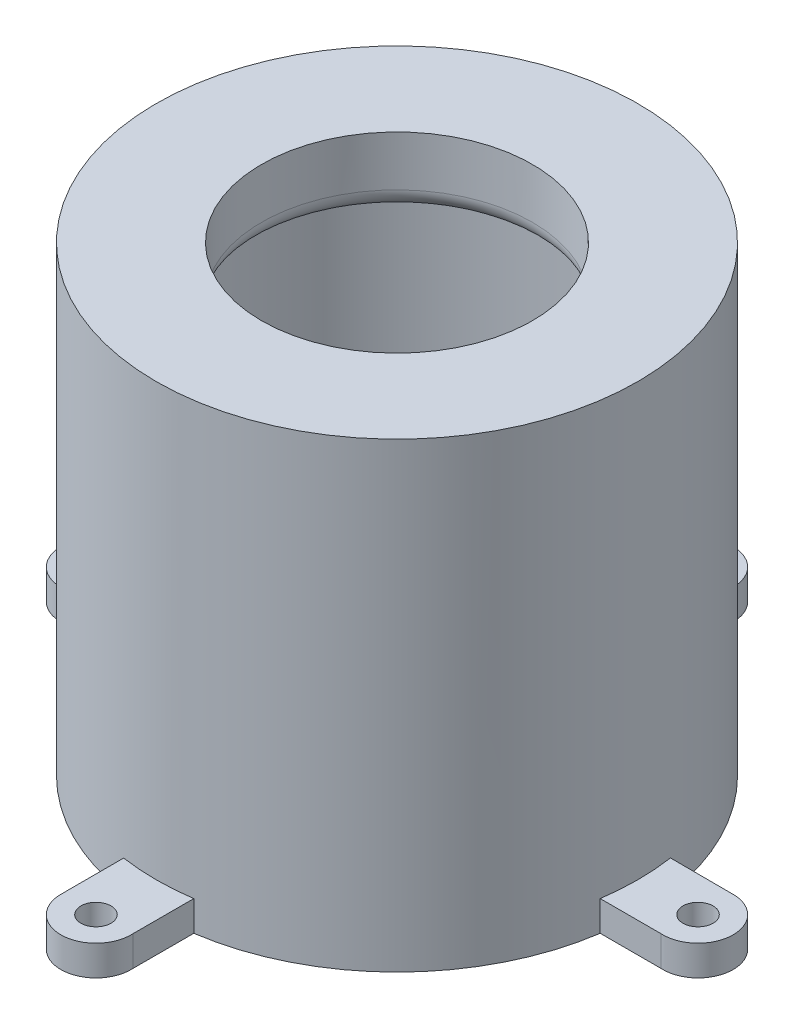
ISO-10303-21;
HEADER;
FILE_DESCRIPTION(('STEP AP214'),'2;1');
FILE_NAME('part.step','',(''),(''),'','','');
FILE_SCHEMA(('AUTOMOTIVE_DESIGN { 1 0 10303 214 1 1 1 1 }'));
ENDSEC;
DATA;
#1=APPLICATION_CONTEXT('core data for automotive mechanical design processes');
#2=APPLICATION_PROTOCOL_DEFINITION('international standard','automotive_design',2000,#1);
#3=PRODUCT_CONTEXT('',#1,'mechanical');
#4=PRODUCT('Part','Part','',(#3));
#5=PRODUCT_RELATED_PRODUCT_CATEGORY('part','',(#4));
#6=PRODUCT_DEFINITION_FORMATION('','',#4);
#7=PRODUCT_DEFINITION_CONTEXT('part definition',#1,'design');
#8=PRODUCT_DEFINITION('design','',#6,#7);
#9=PRODUCT_DEFINITION_SHAPE('','',#8);
#10=(LENGTH_UNIT() NAMED_UNIT(*) SI_UNIT(.MILLI.,.METRE.));
#11=(NAMED_UNIT(*) PLANE_ANGLE_UNIT() SI_UNIT($,.RADIAN.));
#12=(NAMED_UNIT(*) SI_UNIT($,.STERADIAN.) SOLID_ANGLE_UNIT());
#13=UNCERTAINTY_MEASURE_WITH_UNIT(LENGTH_MEASURE(1.E-05),#10,'distance_accuracy_value','');
#14=(GEOMETRIC_REPRESENTATION_CONTEXT(3) GLOBAL_UNCERTAINTY_ASSIGNED_CONTEXT((#13)) GLOBAL_UNIT_ASSIGNED_CONTEXT((#10,
#11,#12)) REPRESENTATION_CONTEXT('',''));
#15=CARTESIAN_POINT('',(0.,0.,0.));
#16=DIRECTION('',(0.,0.,1.));
#17=DIRECTION('',(1.,0.,0.));
#18=AXIS2_PLACEMENT_3D('',#15,#16,#17);
#19=CARTESIAN_POINT('',(0.,43.,0.));
#20=DIRECTION('',(0.,1.,0.));
#21=DIRECTION('',(0.,0.,1.));
#22=AXIS2_PLACEMENT_3D('',#19,#20,#21);
#23=PLANE('',#22);
#24=CARTESIAN_POINT('',(0.,43.,0.));
#25=DIRECTION('',(0.,1.,0.));
#26=DIRECTION('',(0.,0.,1.));
#27=AXIS2_PLACEMENT_3D('',#24,#25,#26);
#28=CIRCLE('',#27,16.5);
#29=CARTESIAN_POINT('',(0.,43.,16.5));
#30=VERTEX_POINT('',#29);
#31=EDGE_CURVE('E44',#30,#30,#28,.T.);
#32=ORIENTED_EDGE('',*,*,#31,.T.);
#33=EDGE_LOOP('',(#32));
#34=FACE_BOUND('',#33,.T.);
#35=CARTESIAN_POINT('',(0.,43.,0.));
#36=DIRECTION('',(0.,1.,0.));
#37=DIRECTION('',(0.,0.,1.));
#38=AXIS2_PLACEMENT_3D('',#35,#36,#37);
#39=CIRCLE('',#38,20.);
#40=CARTESIAN_POINT('',(0.,43.,20.));
#41=VERTEX_POINT('',#40);
#42=EDGE_CURVE('E212',#41,#41,#39,.T.);
#43=ORIENTED_EDGE('',*,*,#42,.F.);
#44=EDGE_LOOP('',(#43));
#45=FACE_BOUND('',#44,.T.);
#46=ADVANCED_FACE('F35',(#34,#45),#23,.F.);
#47=CARTESIAN_POINT('',(0.,3.,0.));
#48=DIRECTION('',(0.,1.,0.));
#49=DIRECTION('',(0.,0.,1.));
#50=AXIS2_PLACEMENT_3D('',#47,#48,#49);
#51=PLANE('',#50);
#52=CARTESIAN_POINT('',(0.,3.,0.));
#53=DIRECTION('',(0.,1.,0.));
#54=DIRECTION('',(0.,0.,1.));
#55=AXIS2_PLACEMENT_3D('',#52,#53,#54);
#56=CIRCLE('',#55,24.);
#57=CARTESIAN_POINT('',(23.7442979265982,3.,3.49404006458791));
#58=VERTEX_POINT('',#57);
#59=CARTESIAN_POINT('',(23.7416081405892,3.,-3.51227033394449));
#60=VERTEX_POINT('',#59);
#61=EDGE_CURVE('E308',#58,#60,#56,.T.);
#62=ORIENTED_EDGE('',*,*,#61,.F.);
#63=DIRECTION('',(1.,0.,0.));
#64=VECTOR('',#63,1.);
#65=CARTESIAN_POINT('',(0.,3.,3.49404006458791));
#66=LINE('',#65,#64);
#67=CARTESIAN_POINT('',(29.7958333333242,3.,3.49404006453598));
#68=VERTEX_POINT('',#67);
#69=EDGE_CURVE('E357',#58,#68,#66,.T.);
#70=ORIENTED_EDGE('',*,*,#69,.T.);
#71=CARTESIAN_POINT('',(30.,3.,0.));
#72=DIRECTION('',(0.,1.,0.));
#73=DIRECTION('',(0.,0.,1.));
#74=AXIS2_PLACEMENT_3D('',#71,#72,#73);
#75=CIRCLE('',#74,3.5);
#76=CARTESIAN_POINT('',(29.7958333333333,3.,-3.49404006448441));
#77=VERTEX_POINT('',#76);
#78=EDGE_CURVE('E359',#68,#77,#75,.T.);
#79=ORIENTED_EDGE('',*,*,#78,.T.);
#80=DIRECTION('',(0.999995466474268,0.,0.00301115109403827));
#81=VECTOR('',#80,1.);
#82=CARTESIAN_POINT('',(0.0107911946070434,3.,-3.58372773330777));
#83=LINE('',#82,#81);
#84=EDGE_CURVE('E361',#60,#77,#83,.T.);
#85=ORIENTED_EDGE('',*,*,#84,.F.);
#86=EDGE_LOOP('',(#62,#70,#79,#85));
#87=FACE_BOUND('',#86,.T.);
#88=CARTESIAN_POINT('',(30.,3.,0.));
#89=DIRECTION('',(0.,1.,0.));
#90=DIRECTION('',(0.,0.,1.));
#91=AXIS2_PLACEMENT_3D('',#88,#89,#90);
#92=CIRCLE('',#91,1.5);
#93=CARTESIAN_POINT('',(30.,3.,1.5));
#94=VERTEX_POINT('',#93);
#95=EDGE_CURVE('E204',#94,#94,#92,.T.);
#96=ORIENTED_EDGE('',*,*,#95,.F.);
#97=EDGE_LOOP('',(#96));
#98=FACE_BOUND('',#97,.T.);
#99=ADVANCED_FACE('F406',(#87,#98),#51,.T.);
#100=CARTESIAN_POINT('',(3.49404006442474,3.,-23.7442979266222));
#101=VERTEX_POINT('',#100);
#102=CARTESIAN_POINT('',(-3.50000000005553,3.,-23.7434201411593));
#103=VERTEX_POINT('',#102);
#104=EDGE_CURVE('E178',#101,#103,#56,.T.);
#105=ORIENTED_EDGE('',*,*,#104,.F.);
#106=DIRECTION('',(0.,0.,-1.));
#107=VECTOR('',#106,1.);
#108=CARTESIAN_POINT('',(3.49404006442474,3.,0.));
#109=LINE('',#108,#107);
#110=CARTESIAN_POINT('',(3.49404006442474,3.,-29.7958333333403));
#111=VERTEX_POINT('',#110);
#112=EDGE_CURVE('E364',#101,#111,#109,.T.);
#113=ORIENTED_EDGE('',*,*,#112,.T.);
#114=CARTESIAN_POINT('',(-5.60820124801552E-11,3.,-30.0000000000566));
#115=DIRECTION('',(0.,1.,0.));
#116=DIRECTION('',(0.,0.,1.));
#117=AXIS2_PLACEMENT_3D('',#114,#115,#116);
#118=CIRCLE('',#117,3.50000000003738);
#119=CARTESIAN_POINT('',(-3.49404006448475,3.,-29.7958333333333));
#120=VERTEX_POINT('',#119);
#121=EDGE_CURVE('E366',#111,#120,#118,.T.);
#122=ORIENTED_EDGE('',*,*,#121,.T.);
#123=CARTESIAN_POINT('',(0.,3.,0.));
#124=DIRECTION('',(0.,1.,0.));
#125=DIRECTION('',(0.,0.,1.));
#126=AXIS2_PLACEMENT_3D('',#123,#124,#125);
#127=CIRCLE('',#126,30.);
#128=CARTESIAN_POINT('',(-3.50000000005553,3.,-29.7951338308726));
#129=VERTEX_POINT('',#128);
#130=EDGE_CURVE('E198',#120,#129,#127,.T.);
#131=ORIENTED_EDGE('',*,*,#130,.T.);
#132=DIRECTION('',(0.,0.,-1.));
#133=VECTOR('',#132,1.);
#134=CARTESIAN_POINT('',(-3.50000000005553,3.,0.));
#135=LINE('',#134,#133);
#136=EDGE_CURVE('E193',#103,#129,#135,.T.);
#137=ORIENTED_EDGE('',*,*,#136,.F.);
#138=EDGE_LOOP('',(#105,#113,#122,#131,#137));
#139=FACE_BOUND('',#138,.T.);
#140=CARTESIAN_POINT('',(-5.65076515789467E-11,3.,-29.9999999999436));
#141=DIRECTION('',(0.,1.,0.));
#142=DIRECTION('',(0.,0.,1.));
#143=AXIS2_PLACEMENT_3D('',#140,#141,#142);
#144=CIRCLE('',#143,1.49999999996262);
#145=CARTESIAN_POINT('',(-5.65076515789467E-11,3.,-28.499999999981));
#146=VERTEX_POINT('',#145);
#147=EDGE_CURVE('E264',#146,#146,#144,.F.);
#148=ORIENTED_EDGE('',*,*,#147,.T.);
#149=EDGE_LOOP('',(#148));
#150=FACE_BOUND('',#149,.T.);
#151=ADVANCED_FACE('F371',(#139,#150),#51,.T.);
#152=CARTESIAN_POINT('',(-23.7200257513752,3.,-3.65518513267104));
#153=VERTEX_POINT('',#152);
#154=CARTESIAN_POINT('',(-23.7442979265982,3.,3.49404006458791));
#155=VERTEX_POINT('',#154);
#156=EDGE_CURVE('E170',#153,#155,#56,.T.);
#157=ORIENTED_EDGE('',*,*,#156,.F.);
#158=DIRECTION('',(0.999995466474268,0.,0.00301115109403841));
#159=VECTOR('',#158,1.);
#160=CARTESIAN_POINT('',(0.0107911946070439,3.,-3.58372773330776));
#161=LINE('',#160,#159);
#162=CARTESIAN_POINT('',(-29.7742509441192,3.,-3.67341540213113));
#163=VERTEX_POINT('',#162);
#164=EDGE_CURVE('E175',#163,#153,#161,.T.);
#165=ORIENTED_EDGE('',*,*,#164,.F.);
#166=CARTESIAN_POINT('',(0.,3.,0.));
#167=DIRECTION('',(0.,1.,0.));
#168=DIRECTION('',(0.,0.,1.));
#169=AXIS2_PLACEMENT_3D('',#166,#167,#168);
#170=CIRCLE('',#169,30.);
#171=CARTESIAN_POINT('',(-29.7958333333215,3.,-3.49404006458572));
#172=VERTEX_POINT('',#171);
#173=EDGE_CURVE('E52',#163,#172,#170,.T.);
#174=ORIENTED_EDGE('',*,*,#173,.T.);
#175=CARTESIAN_POINT('',(-30.000000000113,3.,-4.18977760659527E-13));
#176=DIRECTION('',(0.,1.,0.));
#177=DIRECTION('',(0.,0.,1.));
#178=AXIS2_PLACEMENT_3D('',#175,#176,#177);
#179=CIRCLE('',#178,3.500000000108);
#180=CARTESIAN_POINT('',(-29.7958333333212,3.,3.49404006458791));
#181=VERTEX_POINT('',#180);
#182=EDGE_CURVE('E344',#172,#181,#179,.T.);
#183=ORIENTED_EDGE('',*,*,#182,.T.);
#184=DIRECTION('',(1.,0.,0.));
#185=VECTOR('',#184,1.);
#186=CARTESIAN_POINT('',(0.,3.,3.49404006458791));
#187=LINE('',#186,#185);
#188=EDGE_CURVE('E126',#181,#155,#187,.T.);
#189=ORIENTED_EDGE('',*,*,#188,.T.);
#190=EDGE_LOOP('',(#157,#165,#174,#183,#189));
#191=FACE_BOUND('',#190,.T.);
#192=CARTESIAN_POINT('',(-30.,3.,0.));
#193=DIRECTION('',(0.,1.,0.));
#194=DIRECTION('',(0.,0.,1.));
#195=AXIS2_PLACEMENT_3D('',#192,#193,#194);
#196=CIRCLE('',#195,1.5);
#197=CARTESIAN_POINT('',(-30.,3.,1.5));
#198=VERTEX_POINT('',#197);
#199=EDGE_CURVE('E341',#198,#198,#196,.F.);
#200=ORIENTED_EDGE('',*,*,#199,.T.);
#201=EDGE_LOOP('',(#200));
#202=FACE_BOUND('',#201,.T.);
#203=ADVANCED_FACE('F172',(#191,#202),#51,.T.);
#204=CARTESIAN_POINT('',(-30.000000000113,3.,-4.18977760659527E-13));
#205=DIRECTION('',(0.,-1.,0.));
#206=DIRECTION('',(0.,0.,-1.));
#207=AXIS2_PLACEMENT_3D('',#204,#205,#206);
#208=CYLINDRICAL_SURFACE('',#207,3.500000000108);
#209=CARTESIAN_POINT('',(-30.000000000113,0.,-4.18977760659527E-13));
#210=DIRECTION('',(0.,1.,0.));
#211=DIRECTION('',(0.,0.,1.));
#212=AXIS2_PLACEMENT_3D('',#209,#210,#211);
#213=CIRCLE('',#212,3.500000000108);
#214=CARTESIAN_POINT('',(-29.7958333333215,0.,-3.49404006458572));
#215=VERTEX_POINT('',#214);
#216=CARTESIAN_POINT('',(-29.7958333333212,0.,3.49404006458791));
#217=VERTEX_POINT('',#216);
#218=EDGE_CURVE('E215',#215,#217,#213,.T.);
#219=ORIENTED_EDGE('',*,*,#218,.T.);
#220=DIRECTION('',(0.,-1.,0.));
#221=VECTOR('',#220,1.);
#222=CARTESIAN_POINT('',(-29.7958333333212,3.,3.49404006458791));
#223=LINE('',#222,#221);
#224=EDGE_CURVE('E304',#181,#217,#223,.T.);
#225=ORIENTED_EDGE('',*,*,#224,.F.);
#226=ORIENTED_EDGE('',*,*,#182,.F.);
#227=DIRECTION('',(0.,-1.,0.));
#228=VECTOR('',#227,1.);
#229=CARTESIAN_POINT('',(-29.7958333333215,3.,-3.49404006458572));
#230=LINE('',#229,#228);
#231=EDGE_CURVE('E207',#172,#215,#230,.T.);
#232=ORIENTED_EDGE('',*,*,#231,.T.);
#233=EDGE_LOOP('',(#219,#225,#226,#232));
#234=FACE_BOUND('',#233,.T.);
#235=ADVANCED_FACE('F666',(#234),#208,.T.);
#236=CARTESIAN_POINT('',(0.,3.,3.49404006458791));
#237=DIRECTION('',(0.,0.,-1.));
#238=DIRECTION('',(-1.,0.,0.));
#239=AXIS2_PLACEMENT_3D('',#236,#237,#238);
#240=PLANE('',#239);
#241=DIRECTION('',(1.,0.,0.));
#242=VECTOR('',#241,1.);
#243=CARTESIAN_POINT('',(0.,0.,3.49404006458791));
#244=LINE('',#243,#242);
#245=CARTESIAN_POINT('',(-23.7442979265982,0.,3.49404006458791));
#246=VERTEX_POINT('',#245);
#247=EDGE_CURVE('E218',#217,#246,#244,.T.);
#248=ORIENTED_EDGE('',*,*,#247,.T.);
#249=DIRECTION('',(0.,-1.,0.));
#250=VECTOR('',#249,1.);
#251=CARTESIAN_POINT('',(-23.7442979265982,3.,3.49404006458791));
#252=LINE('',#251,#250);
#253=EDGE_CURVE('E302',#155,#246,#252,.T.);
#254=ORIENTED_EDGE('',*,*,#253,.F.);
#255=ORIENTED_EDGE('',*,*,#188,.F.);
#256=ORIENTED_EDGE('',*,*,#224,.T.);
#257=EDGE_LOOP('',(#248,#254,#255,#256));
#258=FACE_BOUND('',#257,.T.);
#259=ADVANCED_FACE('F835',(#258),#240,.F.);
#260=CARTESIAN_POINT('',(-3.50000000005671,3.,0.));
#261=DIRECTION('',(-1.,0.,0.));
#262=DIRECTION('',(0.,0.,1.));
#263=AXIS2_PLACEMENT_3D('',#260,#261,#262);
#264=PLANE('',#263);
#265=DIRECTION('',(0.,0.,-1.));
#266=VECTOR('',#265,1.);
#267=CARTESIAN_POINT('',(-3.50000000005671,0.,0.));
#268=LINE('',#267,#266);
#269=CARTESIAN_POINT('',(-3.50000000005671,0.,29.7951338308725));
#270=VERTEX_POINT('',#269);
#271=CARTESIAN_POINT('',(-3.50000000005671,0.,23.7434201411592));
#272=VERTEX_POINT('',#271);
#273=EDGE_CURVE('E223',#270,#272,#268,.T.);
#274=ORIENTED_EDGE('',*,*,#273,.F.);
#275=DIRECTION('',(0.,-1.,0.));
#276=VECTOR('',#275,1.);
#277=CARTESIAN_POINT('',(-3.50000000005671,3.,29.7951338308725));
#278=LINE('',#277,#276);
#279=CARTESIAN_POINT('',(-3.50000000005671,3.,29.7951338308725));
#280=VERTEX_POINT('',#279);
#281=EDGE_CURVE('E298',#280,#270,#278,.T.);
#282=ORIENTED_EDGE('',*,*,#281,.F.);
#283=DIRECTION('',(0.,0.,-1.));
#284=VECTOR('',#283,1.);
#285=CARTESIAN_POINT('',(-3.50000000005671,3.,0.));
#286=LINE('',#285,#284);
#287=CARTESIAN_POINT('',(-3.50000000005671,3.,23.7434201411592));
#288=VERTEX_POINT('',#287);
#289=EDGE_CURVE('E347',#280,#288,#286,.T.);
#290=ORIENTED_EDGE('',*,*,#289,.T.);
#291=DIRECTION('',(0.,-1.,0.));
#292=VECTOR('',#291,1.);
#293=CARTESIAN_POINT('',(-3.50000000005671,3.,23.7434201411592));
#294=LINE('',#293,#292);
#295=EDGE_CURVE('E300',#288,#272,#294,.T.);
#296=ORIENTED_EDGE('',*,*,#295,.T.);
#297=EDGE_LOOP('',(#274,#282,#290,#296));
#298=FACE_BOUND('',#297,.T.);
#299=ADVANCED_FACE('F826',(#298),#264,.T.);
#300=CARTESIAN_POINT('',(0.,3.,0.));
#301=DIRECTION('',(0.,-1.,0.));
#302=DIRECTION('',(0.,0.,-1.));
#303=AXIS2_PLACEMENT_3D('',#300,#301,#302);
#304=CYLINDRICAL_SURFACE('',#303,30.);
#305=CARTESIAN_POINT('',(0.,0.,0.));
#306=DIRECTION('',(0.,1.,0.));
#307=DIRECTION('',(0.,0.,1.));
#308=AXIS2_PLACEMENT_3D('',#305,#306,#307);
#309=CIRCLE('',#308,30.);
#310=CARTESIAN_POINT('',(-3.49404006453746,0.,29.7958333333271));
#311=VERTEX_POINT('',#310);
#312=EDGE_CURVE('E227',#270,#311,#309,.T.);
#313=ORIENTED_EDGE('',*,*,#312,.T.);
#314=DIRECTION('',(0.,-1.,0.));
#315=VECTOR('',#314,1.);
#316=CARTESIAN_POINT('',(-3.49404006453746,3.,29.7958333333271));
#317=LINE('',#316,#315);
#318=CARTESIAN_POINT('',(-3.49404006453746,3.,29.7958333333271));
#319=VERTEX_POINT('',#318);
#320=EDGE_CURVE('E295',#319,#311,#317,.T.);
#321=ORIENTED_EDGE('',*,*,#320,.F.);
#322=CARTESIAN_POINT('',(0.,3.,0.));
#323=DIRECTION('',(0.,1.,0.));
#324=DIRECTION('',(0.,0.,1.));
#325=AXIS2_PLACEMENT_3D('',#322,#323,#324);
#326=CIRCLE('',#325,30.);
#327=EDGE_CURVE('E350',#280,#319,#326,.T.);
#328=ORIENTED_EDGE('',*,*,#327,.F.);
#329=ORIENTED_EDGE('',*,*,#281,.T.);
#330=EDGE_LOOP('',(#313,#321,#328,#329));
#331=FACE_BOUND('',#330,.T.);
#332=ADVANCED_FACE('F817',(#331),#304,.T.);
#333=CARTESIAN_POINT('',(-5.67104791211457E-11,3.,30.0000000000564));
#334=DIRECTION('',(0.,-1.,0.));
#335=DIRECTION('',(0.,0.,-1.));
#336=AXIS2_PLACEMENT_3D('',#333,#334,#335);
#337=CYLINDRICAL_SURFACE('',#336,3.5);
#338=CARTESIAN_POINT('',(-5.67104791211457E-11,0.,30.0000000000564));
#339=DIRECTION('',(0.,1.,0.));
#340=DIRECTION('',(0.,0.,1.));
#341=AXIS2_PLACEMENT_3D('',#338,#339,#340);
#342=CIRCLE('',#341,3.5);
#343=CARTESIAN_POINT('',(3.49404006442474,0.,29.795833333339));
#344=VERTEX_POINT('',#343);
#345=EDGE_CURVE('E229',#311,#344,#342,.T.);
#346=ORIENTED_EDGE('',*,*,#345,.T.);
#347=DIRECTION('',(0.,-1.,0.));
#348=VECTOR('',#347,1.);
#349=CARTESIAN_POINT('',(3.49404006442474,3.,29.795833333339));
#350=LINE('',#349,#348);
#351=CARTESIAN_POINT('',(3.49404006442474,3.,29.795833333339));
#352=VERTEX_POINT('',#351);
#353=EDGE_CURVE('E292',#352,#344,#350,.T.);
#354=ORIENTED_EDGE('',*,*,#353,.F.);
#355=CARTESIAN_POINT('',(-5.67104791211457E-11,3.,30.0000000000564));
#356=DIRECTION('',(0.,1.,0.));
#357=DIRECTION('',(0.,0.,1.));
#358=AXIS2_PLACEMENT_3D('',#355,#356,#357);
#359=CIRCLE('',#358,3.5);
#360=EDGE_CURVE('E352',#319,#352,#359,.T.);
#361=ORIENTED_EDGE('',*,*,#360,.F.);
#362=ORIENTED_EDGE('',*,*,#320,.T.);
#363=EDGE_LOOP('',(#346,#354,#361,#362));
#364=FACE_BOUND('',#363,.T.);
#365=ADVANCED_FACE('F808',(#364),#337,.T.);
#366=CARTESIAN_POINT('',(3.49404006442474,3.,0.));
#367=DIRECTION('',(-1.,0.,0.));
#368=DIRECTION('',(0.,0.,1.));
#369=AXIS2_PLACEMENT_3D('',#366,#367,#368);
#370=PLANE('',#369);
#371=DIRECTION('',(0.,0.,-1.));
#372=VECTOR('',#371,1.);
#373=CARTESIAN_POINT('',(3.49404006442474,0.,0.));
#374=LINE('',#373,#372);
#375=CARTESIAN_POINT('',(3.49404006442474,0.,23.7442979266222));
#376=VERTEX_POINT('',#375);
#377=EDGE_CURVE('E231',#344,#376,#374,.T.);
#378=ORIENTED_EDGE('',*,*,#377,.T.);
#379=DIRECTION('',(0.,-1.,0.));
#380=VECTOR('',#379,1.);
#381=CARTESIAN_POINT('',(3.49404006442474,3.,23.7442979266222));
#382=LINE('',#381,#380);
#383=CARTESIAN_POINT('',(3.49404006442474,3.,23.7442979266222));
#384=VERTEX_POINT('',#383);
#385=EDGE_CURVE('E289',#384,#376,#382,.T.);
#386=ORIENTED_EDGE('',*,*,#385,.F.);
#387=DIRECTION('',(0.,0.,-1.));
#388=VECTOR('',#387,1.);
#389=CARTESIAN_POINT('',(3.49404006442474,3.,0.));
#390=LINE('',#389,#388);
#391=EDGE_CURVE('E354',#352,#384,#390,.T.);
#392=ORIENTED_EDGE('',*,*,#391,.F.);
#393=ORIENTED_EDGE('',*,*,#353,.T.);
#394=EDGE_LOOP('',(#378,#386,#392,#393));
#395=FACE_BOUND('',#394,.T.);
#396=ADVANCED_FACE('F800',(#395),#370,.F.);
#397=CARTESIAN_POINT('',(0.,3.,3.49404006458791));
#398=DIRECTION('',(0.,0.,-1.));
#399=DIRECTION('',(-1.,0.,0.));
#400=AXIS2_PLACEMENT_3D('',#397,#398,#399);
#401=PLANE('',#400);
#402=DIRECTION('',(1.,0.,0.));
#403=VECTOR('',#402,1.);
#404=CARTESIAN_POINT('',(0.,0.,3.49404006458791));
#405=LINE('',#404,#403);
#406=CARTESIAN_POINT('',(23.7442979265982,0.,3.49404006458791));
#407=VERTEX_POINT('',#406);
#408=CARTESIAN_POINT('',(29.7958333333242,0.,3.49404006453598));
#409=VERTEX_POINT('',#408);
#410=EDGE_CURVE('E233',#407,#409,#405,.T.);
#411=ORIENTED_EDGE('',*,*,#410,.T.);
#412=DIRECTION('',(0.,-1.,0.));
#413=VECTOR('',#412,1.);
#414=CARTESIAN_POINT('',(29.7958333333242,3.,3.49404006453598));
#415=LINE('',#414,#413);
#416=EDGE_CURVE('E283',#68,#409,#415,.T.);
#417=ORIENTED_EDGE('',*,*,#416,.F.);
#418=ORIENTED_EDGE('',*,*,#69,.F.);
#419=DIRECTION('',(0.,-1.,0.));
#420=VECTOR('',#419,1.);
#421=CARTESIAN_POINT('',(23.7442979265982,3.,3.49404006458791));
#422=LINE('',#421,#420);
#423=EDGE_CURVE('E286',#58,#407,#422,.T.);
#424=ORIENTED_EDGE('',*,*,#423,.T.);
#425=EDGE_LOOP('',(#411,#417,#418,#424));
#426=FACE_BOUND('',#425,.T.);
#427=ADVANCED_FACE('F396',(#426),#401,.F.);
#428=CARTESIAN_POINT('',(30.,3.,0.));
#429=DIRECTION('',(0.,-1.,0.));
#430=DIRECTION('',(0.,0.,-1.));
#431=AXIS2_PLACEMENT_3D('',#428,#429,#430);
#432=CYLINDRICAL_SURFACE('',#431,3.5);
#433=CARTESIAN_POINT('',(30.,0.,0.));
#434=DIRECTION('',(0.,1.,0.));
#435=DIRECTION('',(0.,0.,1.));
#436=AXIS2_PLACEMENT_3D('',#433,#434,#435);
#437=CIRCLE('',#436,3.5);
#438=CARTESIAN_POINT('',(29.7958333333333,0.,-3.49404006448441));
#439=VERTEX_POINT('',#438);
#440=EDGE_CURVE('E235',#409,#439,#437,.T.);
#441=ORIENTED_EDGE('',*,*,#440,.T.);
#442=DIRECTION('',(0.,-1.,0.));
#443=VECTOR('',#442,1.);
#444=CARTESIAN_POINT('',(29.7958333333333,3.,-3.49404006448441));
#445=LINE('',#444,#443);
#446=EDGE_CURVE('E281',#77,#439,#445,.T.);
#447=ORIENTED_EDGE('',*,*,#446,.F.);
#448=ORIENTED_EDGE('',*,*,#78,.F.);
#449=ORIENTED_EDGE('',*,*,#416,.T.);
#450=EDGE_LOOP('',(#441,#447,#448,#449));
#451=FACE_BOUND('',#450,.T.);
#452=ADVANCED_FACE('F402',(#451),#432,.T.);
#453=CARTESIAN_POINT('',(0.0107911946070434,3.,-3.58372773330777));
#454=DIRECTION('',(0.00301115109403827,0.,-0.999995466474268));
#455=DIRECTION('',(-0.999995466474268,0.,-0.00301115109403827));
#456=AXIS2_PLACEMENT_3D('',#453,#454,#455);
#457=PLANE('',#456);
#458=DIRECTION('',(0.999995466474268,0.,0.00301115109403827));
#459=VECTOR('',#458,1.);
#460=CARTESIAN_POINT('',(0.0107911946070434,0.,-3.58372773330777));
#461=LINE('',#460,#459);
#462=CARTESIAN_POINT('',(23.7416081405892,0.,-3.51227033394449));
#463=VERTEX_POINT('',#462);
#464=EDGE_CURVE('E238',#463,#439,#461,.T.);
#465=ORIENTED_EDGE('',*,*,#464,.F.);
#466=DIRECTION('',(0.,-1.,0.));
#467=VECTOR('',#466,1.);
#468=CARTESIAN_POINT('',(23.7416081405892,3.,-3.51227033394449));
#469=LINE('',#468,#467);
#470=EDGE_CURVE('E279',#60,#463,#469,.T.);
#471=ORIENTED_EDGE('',*,*,#470,.F.);
#472=ORIENTED_EDGE('',*,*,#84,.T.);
#473=ORIENTED_EDGE('',*,*,#446,.T.);
#474=EDGE_LOOP('',(#465,#471,#472,#473));
#475=FACE_BOUND('',#474,.T.);
#476=ADVANCED_FACE('F411',(#475),#457,.T.);
#477=CARTESIAN_POINT('',(3.49404006442474,3.,0.));
#478=DIRECTION('',(-1.,0.,0.));
#479=DIRECTION('',(0.,0.,1.));
#480=AXIS2_PLACEMENT_3D('',#477,#478,#479);
#481=PLANE('',#480);
#482=DIRECTION('',(0.,0.,-1.));
#483=VECTOR('',#482,1.);
#484=CARTESIAN_POINT('',(3.49404006442474,0.,0.));
#485=LINE('',#484,#483);
#486=CARTESIAN_POINT('',(3.49404006442474,0.,-23.7442979266222));
#487=VERTEX_POINT('',#486);
#488=CARTESIAN_POINT('',(3.49404006442474,0.,-29.7958333333403));
#489=VERTEX_POINT('',#488);
#490=EDGE_CURVE('E242',#487,#489,#485,.T.);
#491=ORIENTED_EDGE('',*,*,#490,.T.);
#492=DIRECTION('',(0.,-1.,0.));
#493=VECTOR('',#492,1.);
#494=CARTESIAN_POINT('',(3.49404006442474,3.,-29.7958333333403));
#495=LINE('',#494,#493);
#496=EDGE_CURVE('E273',#111,#489,#495,.T.);
#497=ORIENTED_EDGE('',*,*,#496,.F.);
#498=ORIENTED_EDGE('',*,*,#112,.F.);
#499=DIRECTION('',(0.,-1.,0.));
#500=VECTOR('',#499,1.);
#501=CARTESIAN_POINT('',(3.49404006442474,3.,-23.7442979266222));
#502=LINE('',#501,#500);
#503=EDGE_CURVE('E276',#101,#487,#502,.T.);
#504=ORIENTED_EDGE('',*,*,#503,.T.);
#505=EDGE_LOOP('',(#491,#497,#498,#504));
#506=FACE_BOUND('',#505,.T.);
#507=ADVANCED_FACE('F413',(#506),#481,.F.);
#508=CARTESIAN_POINT('',(-5.60820124801552E-11,3.,-30.0000000000566));
#509=DIRECTION('',(0.,-1.,0.));
#510=DIRECTION('',(0.,0.,-1.));
#511=AXIS2_PLACEMENT_3D('',#508,#509,#510);
#512=CYLINDRICAL_SURFACE('',#511,3.50000000003738);
#513=CARTESIAN_POINT('',(-5.60820124801552E-11,0.,-30.0000000000566));
#514=DIRECTION('',(0.,1.,0.));
#515=DIRECTION('',(0.,0.,1.));
#516=AXIS2_PLACEMENT_3D('',#513,#514,#515);
#517=CIRCLE('',#516,3.50000000003738);
#518=CARTESIAN_POINT('',(-3.49404006448475,0.,-29.7958333333333));
#519=VERTEX_POINT('',#518);
#520=EDGE_CURVE('E244',#489,#519,#517,.T.);
#521=ORIENTED_EDGE('',*,*,#520,.T.);
#522=DIRECTION('',(0.,-1.,0.));
#523=VECTOR('',#522,1.);
#524=CARTESIAN_POINT('',(-3.49404006448475,3.,-29.7958333333333));
#525=LINE('',#524,#523);
#526=EDGE_CURVE('E270',#120,#519,#525,.T.);
#527=ORIENTED_EDGE('',*,*,#526,.F.);
#528=ORIENTED_EDGE('',*,*,#121,.F.);
#529=ORIENTED_EDGE('',*,*,#496,.T.);
#530=EDGE_LOOP('',(#521,#527,#528,#529));
#531=FACE_BOUND('',#530,.T.);
#532=ADVANCED_FACE('F419',(#531),#512,.T.);
#533=CARTESIAN_POINT('',(0.,3.,0.));
#534=DIRECTION('',(0.,-1.,0.));
#535=DIRECTION('',(0.,0.,-1.));
#536=AXIS2_PLACEMENT_3D('',#533,#534,#535);
#537=CYLINDRICAL_SURFACE('',#536,30.);
#538=CARTESIAN_POINT('',(0.,0.,0.));
#539=DIRECTION('',(0.,1.,0.));
#540=DIRECTION('',(0.,0.,1.));
#541=AXIS2_PLACEMENT_3D('',#538,#539,#540);
#542=CIRCLE('',#541,30.);
#543=CARTESIAN_POINT('',(-3.50000000005553,0.,-29.7951338308726));
#544=VERTEX_POINT('',#543);
#545=EDGE_CURVE('E246',#519,#544,#542,.T.);
#546=ORIENTED_EDGE('',*,*,#545,.T.);
#547=DIRECTION('',(0.,-1.,0.));
#548=VECTOR('',#547,1.);
#549=CARTESIAN_POINT('',(-3.50000000005553,3.,-29.7951338308726));
#550=LINE('',#549,#548);
#551=EDGE_CURVE('E268',#129,#544,#550,.T.);
#552=ORIENTED_EDGE('',*,*,#551,.F.);
#553=ORIENTED_EDGE('',*,*,#130,.F.);
#554=ORIENTED_EDGE('',*,*,#526,.T.);
#555=EDGE_LOOP('',(#546,#552,#553,#554));
#556=FACE_BOUND('',#555,.T.);
#557=ADVANCED_FACE('F377',(#556),#537,.T.);
#558=CARTESIAN_POINT('',(-3.50000000005553,3.,0.));
#559=DIRECTION('',(-1.,0.,0.));
#560=DIRECTION('',(0.,0.,1.));
#561=AXIS2_PLACEMENT_3D('',#558,#559,#560);
#562=PLANE('',#561);
#563=DIRECTION('',(0.,0.,-1.));
#564=VECTOR('',#563,1.);
#565=CARTESIAN_POINT('',(-3.50000000005553,0.,0.));
#566=LINE('',#565,#564);
#567=CARTESIAN_POINT('',(-3.50000000005553,0.,-23.7434201411593));
#568=VERTEX_POINT('',#567);
#569=EDGE_CURVE('E249',#568,#544,#566,.T.);
#570=ORIENTED_EDGE('',*,*,#569,.F.);
#571=DIRECTION('',(0.,-1.,0.));
#572=VECTOR('',#571,1.);
#573=CARTESIAN_POINT('',(-3.50000000005553,3.,-23.7434201411593));
#574=LINE('',#573,#572);
#575=EDGE_CURVE('E190',#103,#568,#574,.T.);
#576=ORIENTED_EDGE('',*,*,#575,.F.);
#577=ORIENTED_EDGE('',*,*,#136,.T.);
#578=ORIENTED_EDGE('',*,*,#551,.T.);
#579=EDGE_LOOP('',(#570,#576,#577,#578));
#580=FACE_BOUND('',#579,.T.);
#581=ADVANCED_FACE('F381',(#580),#562,.T.);
#582=CARTESIAN_POINT('',(0.,3.,0.));
#583=DIRECTION('',(0.,-1.,0.));
#584=DIRECTION('',(0.,0.,-1.));
#585=AXIS2_PLACEMENT_3D('',#582,#583,#584);
#586=CYLINDRICAL_SURFACE('',#585,24.);
#587=CARTESIAN_POINT('',(0.,0.,0.));
#588=DIRECTION('',(0.,1.,0.));
#589=DIRECTION('',(0.,0.,1.));
#590=AXIS2_PLACEMENT_3D('',#587,#588,#589);
#591=CIRCLE('',#590,24.);
#592=CARTESIAN_POINT('',(-23.7200257513752,0.,-3.65518513267104));
#593=VERTEX_POINT('',#592);
#594=EDGE_CURVE('E186',#568,#593,#591,.T.);
#595=ORIENTED_EDGE('',*,*,#594,.T.);
#596=DIRECTION('',(0.,-1.,0.));
#597=VECTOR('',#596,1.);
#598=CARTESIAN_POINT('',(-23.7200257513752,3.,-3.65518513267104));
#599=LINE('',#598,#597);
#600=EDGE_CURVE('E182',#153,#593,#599,.T.);
#601=ORIENTED_EDGE('',*,*,#600,.F.);
#602=ORIENTED_EDGE('',*,*,#156,.T.);
#603=ORIENTED_EDGE('',*,*,#253,.T.);
#604=EDGE_CURVE('E220',#246,#272,#591,.T.);
#605=ORIENTED_EDGE('',*,*,#604,.T.);
#606=ORIENTED_EDGE('',*,*,#295,.F.);
#607=EDGE_CURVE('E179',#288,#384,#56,.T.);
#608=ORIENTED_EDGE('',*,*,#607,.T.);
#609=ORIENTED_EDGE('',*,*,#385,.T.);
#610=EDGE_CURVE('E224',#376,#407,#591,.T.);
#611=ORIENTED_EDGE('',*,*,#610,.T.);
#612=ORIENTED_EDGE('',*,*,#423,.F.);
#613=ORIENTED_EDGE('',*,*,#61,.T.);
#614=ORIENTED_EDGE('',*,*,#470,.T.);
#615=EDGE_CURVE('E241',#463,#487,#591,.T.);
#616=ORIENTED_EDGE('',*,*,#615,.T.);
#617=ORIENTED_EDGE('',*,*,#503,.F.);
#618=ORIENTED_EDGE('',*,*,#104,.T.);
#619=ORIENTED_EDGE('',*,*,#575,.T.);
#620=EDGE_LOOP('',(#595,#601,#602,#603,#605,#606,#608,#609,#611,#612,#613,#614,#616,#617,#618,#619));
#621=FACE_BOUND('',#620,.T.);
#622=CARTESIAN_POINT('',(0.,46.,0.));
#623=DIRECTION('',(0.,1.,0.));
#624=DIRECTION('',(0.,0.,1.));
#625=AXIS2_PLACEMENT_3D('',#622,#623,#624);
#626=CIRCLE('',#625,24.);
#627=CARTESIAN_POINT('',(0.,46.,24.));
#628=VERTEX_POINT('',#627);
#629=EDGE_CURVE('E331',#628,#628,#626,.T.);
#630=ORIENTED_EDGE('',*,*,#629,.F.);
#631=EDGE_LOOP('',(#630));
#632=FACE_BOUND('',#631,.T.);
#633=ADVANCED_FACE('F183',(#621,#632),#586,.T.);
#634=CARTESIAN_POINT('',(0.0107911946070439,3.,-3.58372773330776));
#635=DIRECTION('',(0.00301115109403841,0.,-0.999995466474268));
#636=DIRECTION('',(-0.999995466474268,0.,-0.00301115109403841));
#637=AXIS2_PLACEMENT_3D('',#634,#635,#636);
#638=PLANE('',#637);
#639=DIRECTION('',(0.999995466474268,0.,0.00301115109403841));
#640=VECTOR('',#639,1.);
#641=CARTESIAN_POINT('',(0.0107911946070439,0.,-3.58372773330776));
#642=LINE('',#641,#640);
#643=CARTESIAN_POINT('',(-29.7742509441192,0.,-3.67341540213113));
#644=VERTEX_POINT('',#643);
#645=EDGE_CURVE('E252',#644,#593,#642,.T.);
#646=ORIENTED_EDGE('',*,*,#645,.F.);
#647=DIRECTION('',(0.,-1.,0.));
#648=VECTOR('',#647,1.);
#649=CARTESIAN_POINT('',(-29.7742509441192,3.,-3.67341540213113));
#650=LINE('',#649,#648);
#651=EDGE_CURVE('E114',#163,#644,#650,.T.);
#652=ORIENTED_EDGE('',*,*,#651,.F.);
#653=ORIENTED_EDGE('',*,*,#164,.T.);
#654=ORIENTED_EDGE('',*,*,#600,.T.);
#655=EDGE_LOOP('',(#646,#652,#653,#654));
#656=FACE_BOUND('',#655,.T.);
#657=ADVANCED_FACE('F192',(#656),#638,.T.);
#658=CARTESIAN_POINT('',(-5.67104791211457E-11,3.,30.0000000000564));
#659=DIRECTION('',(0.,-1.,0.));
#660=DIRECTION('',(0.,0.,-1.));
#661=AXIS2_PLACEMENT_3D('',#658,#659,#660);
#662=CYLINDRICAL_SURFACE('',#661,1.49999999996262);
#663=CARTESIAN_POINT('',(-5.67104791211457E-11,3.,30.0000000000564));
#664=DIRECTION('',(0.,1.,0.));
#665=DIRECTION('',(0.,0.,1.));
#666=AXIS2_PLACEMENT_3D('',#663,#664,#665);
#667=CIRCLE('',#666,1.49999999996262);
#668=CARTESIAN_POINT('',(-5.67104791211457E-11,3.,31.500000000019));
#669=VERTEX_POINT('',#668);
#670=EDGE_CURVE('E195',#669,#669,#667,.T.);
#671=ORIENTED_EDGE('',*,*,#670,.T.);
#672=EDGE_LOOP('',(#671));
#673=FACE_BOUND('',#672,.T.);
#674=CARTESIAN_POINT('',(-5.67104791211457E-11,0.,30.0000000000564));
#675=DIRECTION('',(0.,1.,0.));
#676=DIRECTION('',(0.,0.,1.));
#677=AXIS2_PLACEMENT_3D('',#674,#675,#676);
#678=CIRCLE('',#677,1.49999999996262);
#679=CARTESIAN_POINT('',(-5.67104791211457E-11,0.,31.500000000019));
#680=VERTEX_POINT('',#679);
#681=EDGE_CURVE('E258',#680,#680,#678,.T.);
#682=ORIENTED_EDGE('',*,*,#681,.F.);
#683=EDGE_LOOP('',(#682));
#684=FACE_BOUND('',#683,.T.);
#685=ADVANCED_FACE('F444',(#673,#684),#662,.F.);
#686=CARTESIAN_POINT('',(0.,3.,0.));
#687=DIRECTION('',(0.,-1.,0.));
#688=DIRECTION('',(0.,0.,-1.));
#689=AXIS2_PLACEMENT_3D('',#686,#687,#688);
#690=CYLINDRICAL_SURFACE('',#689,20.);
#691=CARTESIAN_POINT('',(0.,0.,0.));
#692=DIRECTION('',(0.,1.,0.));
#693=DIRECTION('',(0.,0.,1.));
#694=AXIS2_PLACEMENT_3D('',#691,#692,#693);
#695=CIRCLE('',#694,20.);
#696=CARTESIAN_POINT('',(0.,0.,20.));
#697=VERTEX_POINT('',#696);
#698=EDGE_CURVE('E255',#697,#697,#695,.T.);
#699=ORIENTED_EDGE('',*,*,#698,.F.);
#700=EDGE_LOOP('',(#699));
#701=FACE_BOUND('',#700,.T.);
#702=ORIENTED_EDGE('',*,*,#42,.T.);
#703=EDGE_LOOP('',(#702));
#704=FACE_BOUND('',#703,.T.);
#705=ADVANCED_FACE('F447',(#701,#704),#690,.F.);
#706=CARTESIAN_POINT('',(0.,3.,0.));
#707=DIRECTION('',(0.,-1.,0.));
#708=DIRECTION('',(0.,0.,-1.));
#709=AXIS2_PLACEMENT_3D('',#706,#707,#708);
#710=CYLINDRICAL_SURFACE('',#709,30.);
#711=CARTESIAN_POINT('',(0.,0.,0.));
#712=DIRECTION('',(0.,1.,0.));
#713=DIRECTION('',(0.,0.,1.));
#714=AXIS2_PLACEMENT_3D('',#711,#712,#713);
#715=CIRCLE('',#714,30.);
#716=EDGE_CURVE('E117',#644,#215,#715,.T.);
#717=ORIENTED_EDGE('',*,*,#716,.T.);
#718=ORIENTED_EDGE('',*,*,#231,.F.);
#719=ORIENTED_EDGE('',*,*,#173,.F.);
#720=ORIENTED_EDGE('',*,*,#651,.T.);
#721=EDGE_LOOP('',(#717,#718,#719,#720));
#722=FACE_BOUND('',#721,.T.);
#723=ADVANCED_FACE('F451',(#722),#710,.T.);
#724=CARTESIAN_POINT('',(-30.,3.,0.));
#725=DIRECTION('',(0.,-1.,0.));
#726=DIRECTION('',(0.,0.,-1.));
#727=AXIS2_PLACEMENT_3D('',#724,#725,#726);
#728=CYLINDRICAL_SURFACE('',#727,1.5);
#729=ORIENTED_EDGE('',*,*,#199,.F.);
#730=EDGE_LOOP('',(#729));
#731=FACE_BOUND('',#730,.T.);
#732=CARTESIAN_POINT('',(-30.,0.,0.));
#733=DIRECTION('',(0.,1.,0.));
#734=DIRECTION('',(0.,0.,1.));
#735=AXIS2_PLACEMENT_3D('',#732,#733,#734);
#736=CIRCLE('',#735,1.5);
#737=CARTESIAN_POINT('',(-30.,0.,1.5));
#738=VERTEX_POINT('',#737);
#739=EDGE_CURVE('E211',#738,#738,#736,.F.);
#740=ORIENTED_EDGE('',*,*,#739,.T.);
#741=EDGE_LOOP('',(#740));
#742=FACE_BOUND('',#741,.T.);
#743=ADVANCED_FACE('F455',(#731,#742),#728,.F.);
#744=CARTESIAN_POINT('',(-5.65076515789467E-11,3.,-29.9999999999436));
#745=DIRECTION('',(0.,-1.,0.));
#746=DIRECTION('',(0.,0.,-1.));
#747=AXIS2_PLACEMENT_3D('',#744,#745,#746);
#748=CYLINDRICAL_SURFACE('',#747,1.49999999996262);
#749=ORIENTED_EDGE('',*,*,#147,.F.);
#750=EDGE_LOOP('',(#749));
#751=FACE_BOUND('',#750,.T.);
#752=CARTESIAN_POINT('',(-5.65076515789467E-11,0.,-29.9999999999436));
#753=DIRECTION('',(0.,1.,0.));
#754=DIRECTION('',(0.,0.,1.));
#755=AXIS2_PLACEMENT_3D('',#752,#753,#754);
#756=CIRCLE('',#755,1.49999999996262);
#757=CARTESIAN_POINT('',(-5.65076515789467E-11,0.,-28.499999999981));
#758=VERTEX_POINT('',#757);
#759=EDGE_CURVE('E208',#758,#758,#756,.F.);
#760=ORIENTED_EDGE('',*,*,#759,.T.);
#761=EDGE_LOOP('',(#760));
#762=FACE_BOUND('',#761,.T.);
#763=ADVANCED_FACE('F442',(#751,#762),#748,.F.);
#764=CARTESIAN_POINT('',(30.,3.,0.));
#765=DIRECTION('',(0.,-1.,0.));
#766=DIRECTION('',(0.,0.,-1.));
#767=AXIS2_PLACEMENT_3D('',#764,#765,#766);
#768=CYLINDRICAL_SURFACE('',#767,1.5);
#769=ORIENTED_EDGE('',*,*,#95,.T.);
#770=EDGE_LOOP('',(#769));
#771=FACE_BOUND('',#770,.T.);
#772=CARTESIAN_POINT('',(30.,0.,0.));
#773=DIRECTION('',(0.,1.,0.));
#774=DIRECTION('',(0.,0.,1.));
#775=AXIS2_PLACEMENT_3D('',#772,#773,#774);
#776=CIRCLE('',#775,1.5);
#777=CARTESIAN_POINT('',(30.,0.,1.5));
#778=VERTEX_POINT('',#777);
#779=EDGE_CURVE('E261',#778,#778,#776,.T.);
#780=ORIENTED_EDGE('',*,*,#779,.F.);
#781=EDGE_LOOP('',(#780));
#782=FACE_BOUND('',#781,.T.);
#783=ADVANCED_FACE('F435',(#771,#782),#768,.F.);
#784=ORIENTED_EDGE('',*,*,#607,.F.);
#785=ORIENTED_EDGE('',*,*,#289,.F.);
#786=ORIENTED_EDGE('',*,*,#327,.T.);
#787=ORIENTED_EDGE('',*,*,#360,.T.);
#788=ORIENTED_EDGE('',*,*,#391,.T.);
#789=EDGE_LOOP('',(#784,#785,#786,#787,#788));
#790=FACE_BOUND('',#789,.T.);
#791=ORIENTED_EDGE('',*,*,#670,.F.);
#792=EDGE_LOOP('',(#791));
#793=FACE_BOUND('',#792,.T.);
#794=ADVANCED_FACE('F429',(#790,#793),#51,.T.);
#795=CARTESIAN_POINT('',(0.,0.,0.));
#796=DIRECTION('',(0.,1.,0.));
#797=DIRECTION('',(0.,0.,1.));
#798=AXIS2_PLACEMENT_3D('',#795,#796,#797);
#799=PLANE('',#798);
#800=ORIENTED_EDGE('',*,*,#759,.F.);
#801=EDGE_LOOP('',(#800));
#802=FACE_BOUND('',#801,.T.);
#803=ORIENTED_EDGE('',*,*,#739,.F.);
#804=EDGE_LOOP('',(#803));
#805=FACE_BOUND('',#804,.T.);
#806=ORIENTED_EDGE('',*,*,#218,.F.);
#807=ORIENTED_EDGE('',*,*,#716,.F.);
#808=ORIENTED_EDGE('',*,*,#645,.T.);
#809=ORIENTED_EDGE('',*,*,#594,.F.);
#810=ORIENTED_EDGE('',*,*,#569,.T.);
#811=ORIENTED_EDGE('',*,*,#545,.F.);
#812=ORIENTED_EDGE('',*,*,#520,.F.);
#813=ORIENTED_EDGE('',*,*,#490,.F.);
#814=ORIENTED_EDGE('',*,*,#615,.F.);
#815=ORIENTED_EDGE('',*,*,#464,.T.);
#816=ORIENTED_EDGE('',*,*,#440,.F.);
#817=ORIENTED_EDGE('',*,*,#410,.F.);
#818=ORIENTED_EDGE('',*,*,#610,.F.);
#819=ORIENTED_EDGE('',*,*,#377,.F.);
#820=ORIENTED_EDGE('',*,*,#345,.F.);
#821=ORIENTED_EDGE('',*,*,#312,.F.);
#822=ORIENTED_EDGE('',*,*,#273,.T.);
#823=ORIENTED_EDGE('',*,*,#604,.F.);
#824=ORIENTED_EDGE('',*,*,#247,.F.);
#825=EDGE_LOOP('',(#806,#807,#808,#809,#810,#811,#812,#813,#814,#815,#816,#817,#818,#819,#820,
#821,#822,#823,#824));
#826=FACE_BOUND('',#825,.T.);
#827=ORIENTED_EDGE('',*,*,#698,.T.);
#828=EDGE_LOOP('',(#827));
#829=FACE_BOUND('',#828,.T.);
#830=ORIENTED_EDGE('',*,*,#681,.T.);
#831=EDGE_LOOP('',(#830));
#832=FACE_BOUND('',#831,.T.);
#833=ORIENTED_EDGE('',*,*,#779,.T.);
#834=EDGE_LOOP('',(#833));
#835=FACE_BOUND('',#834,.T.);
#836=ADVANCED_FACE('F385',(#802,#805,#826,#829,#832,#835),#799,.F.);
#837=CARTESIAN_POINT('',(0.,46.,0.));
#838=DIRECTION('',(0.,1.,0.));
#839=DIRECTION('',(0.,0.,1.));
#840=AXIS2_PLACEMENT_3D('',#837,#838,#839);
#841=PLANE('',#840);
#842=CARTESIAN_POINT('',(0.,46.,0.));
#843=DIRECTION('',(0.,1.,0.));
#844=DIRECTION('',(0.,0.,1.));
#845=AXIS2_PLACEMENT_3D('',#842,#843,#844);
#846=CIRCLE('',#845,13.5);
#847=CARTESIAN_POINT('',(0.,46.,13.5));
#848=VERTEX_POINT('',#847);
#849=EDGE_CURVE('E328',#848,#848,#846,.T.);
#850=ORIENTED_EDGE('',*,*,#849,.F.);
#851=EDGE_LOOP('',(#850));
#852=FACE_BOUND('',#851,.T.);
#853=ORIENTED_EDGE('',*,*,#629,.T.);
#854=EDGE_LOOP('',(#853));
#855=FACE_BOUND('',#854,.T.);
#856=ADVANCED_FACE('F431',(#852,#855),#841,.T.);
#857=CARTESIAN_POINT('',(0.,0.,0.));
#858=DIRECTION('',(0.,1.,0.));
#859=DIRECTION('',(0.,0.,1.));
#860=AXIS2_PLACEMENT_3D('',#857,#858,#859);
#861=CYLINDRICAL_SURFACE('',#860,13.5);
#862=CARTESIAN_POINT('',(0.,41.,0.));
#863=DIRECTION('',(0.,-1.,0.));
#864=DIRECTION('',(0.,0.,-1.));
#865=AXIS2_PLACEMENT_3D('',#862,#863,#864);
#866=CIRCLE('',#865,13.5);
#867=CARTESIAN_POINT('',(0.,41.,-13.5));
#868=VERTEX_POINT('',#867);
#869=EDGE_CURVE('E11',#868,#868,#866,.T.);
#870=ORIENTED_EDGE('',*,*,#869,.T.);
#871=EDGE_LOOP('',(#870));
#872=FACE_BOUND('',#871,.T.);
#873=ORIENTED_EDGE('',*,*,#849,.T.);
#874=EDGE_LOOP('',(#873));
#875=FACE_BOUND('',#874,.T.);
#876=ADVANCED_FACE('F322',(#872,#875),#861,.F.);
#877=CARTESIAN_POINT('',(0.,39.,0.));
#878=DIRECTION('',(0.,1.,0.));
#879=DIRECTION('',(0.,0.,1.));
#880=AXIS2_PLACEMENT_3D('',#877,#878,#879);
#881=CYLINDRICAL_SURFACE('',#880,15.5);
#882=CARTESIAN_POINT('',(0.,42.,0.));
#883=DIRECTION('',(0.,1.,0.));
#884=DIRECTION('',(0.,0.,1.));
#885=AXIS2_PLACEMENT_3D('',#882,#883,#884);
#886=CIRCLE('',#885,15.5);
#887=CARTESIAN_POINT('',(0.,42.,15.5));
#888=VERTEX_POINT('',#887);
#889=EDGE_CURVE('E306',#888,#888,#886,.F.);
#890=ORIENTED_EDGE('',*,*,#889,.T.);
#891=EDGE_LOOP('',(#890));
#892=FACE_BOUND('',#891,.T.);
#893=CARTESIAN_POINT('',(0.,39.,0.));
#894=DIRECTION('',(0.,-1.,0.));
#895=DIRECTION('',(0.,0.,-1.));
#896=AXIS2_PLACEMENT_3D('',#893,#894,#895);
#897=CIRCLE('',#896,15.5);
#898=CARTESIAN_POINT('',(0.,39.,-15.5));
#899=VERTEX_POINT('',#898);
#900=EDGE_CURVE('E326',#899,#899,#897,.T.);
#901=ORIENTED_EDGE('',*,*,#900,.F.);
#902=EDGE_LOOP('',(#901));
#903=FACE_BOUND('',#902,.T.);
#904=ADVANCED_FACE('F317',(#892,#903),#881,.T.);
#905=CARTESIAN_POINT('',(0.,42.,0.));
#906=DIRECTION('',(0.,1.,0.));
#907=DIRECTION('',(0.,0.,1.));
#908=AXIS2_PLACEMENT_3D('',#905,#906,#907);
#909=TOROIDAL_SURFACE('',#908,16.5,1.);
#910=ORIENTED_EDGE('',*,*,#31,.F.);
#911=EDGE_LOOP('',(#910));
#912=FACE_BOUND('',#911,.T.);
#913=ORIENTED_EDGE('',*,*,#889,.F.);
#914=EDGE_LOOP('',(#913));
#915=FACE_BOUND('',#914,.T.);
#916=ADVANCED_FACE('F314',(#912,#915),#909,.F.);
#917=CARTESIAN_POINT('',(0.,41.,0.));
#918=DIRECTION('',(0.,-1.,0.));
#919=DIRECTION('',(0.,0.,-1.));
#920=AXIS2_PLACEMENT_3D('',#917,#918,#919);
#921=TOROIDAL_SURFACE('',#920,15.5,2.);
#922=ORIENTED_EDGE('',*,*,#900,.T.);
#923=EDGE_LOOP('',(#922));
#924=FACE_BOUND('',#923,.T.);
#925=ORIENTED_EDGE('',*,*,#869,.F.);
#926=EDGE_LOOP('',(#925));
#927=FACE_BOUND('',#926,.T.);
#928=ADVANCED_FACE('F37',(#924,#927),#921,.T.);
#929=CLOSED_SHELL('',(#46,#99,#151,#203,#235,#259,#299,#332,#365,#396,#427,#452,#476,#507,#532,
#557,#581,#633,#657,#685,#705,#723,#743,#763,#783,#794,#836,#856,#876,#904,#916,#928));
#930=MANIFOLD_SOLID_BREP('B2',#929);
#931=ADVANCED_BREP_SHAPE_REPRESENTATION('',(#18,#930),#14);
#932=SHAPE_DEFINITION_REPRESENTATION(#9,#931);
ENDSEC;
END-ISO-10303-21;
